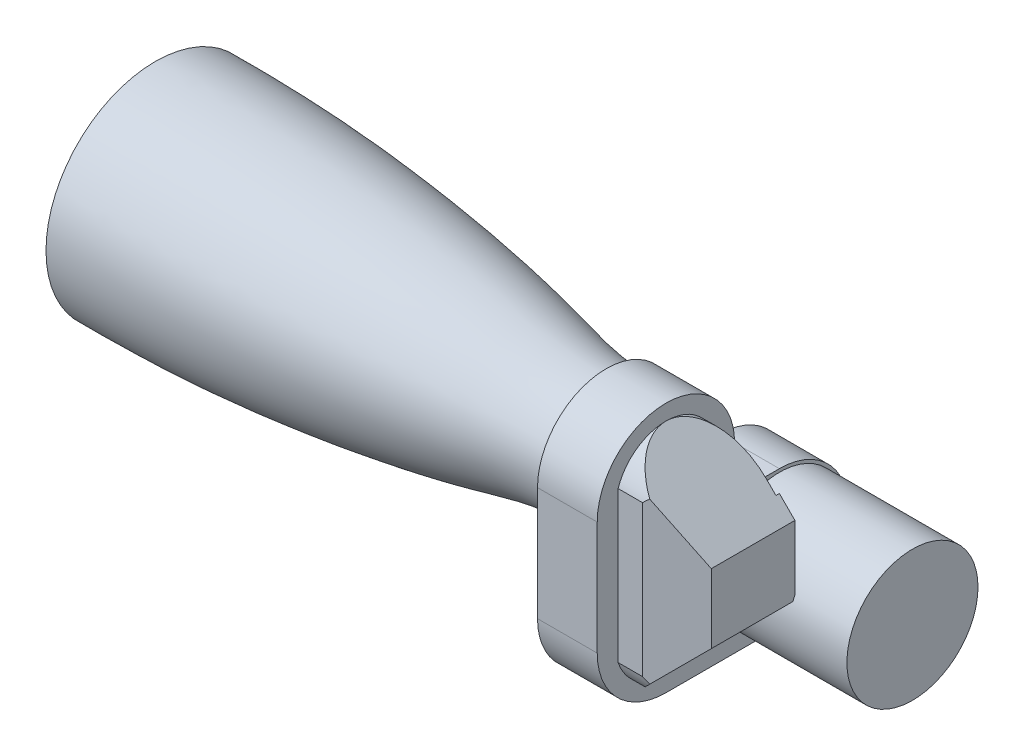
ISO-10303-21;
HEADER;
FILE_DESCRIPTION(('STEP AP214'),'2;1');
FILE_NAME('part.step','',(''),(''),'','','');
FILE_SCHEMA(('AUTOMOTIVE_DESIGN { 1 0 10303 214 1 1 1 1 }'));
ENDSEC;
DATA;
#1=APPLICATION_CONTEXT('core data for automotive mechanical design processes');
#2=APPLICATION_PROTOCOL_DEFINITION('international standard','automotive_design',2000,#1);
#3=PRODUCT_CONTEXT('',#1,'mechanical');
#4=PRODUCT('Part','Part','',(#3));
#5=PRODUCT_RELATED_PRODUCT_CATEGORY('part','',(#4));
#6=PRODUCT_DEFINITION_FORMATION('','',#4);
#7=PRODUCT_DEFINITION_CONTEXT('part definition',#1,'design');
#8=PRODUCT_DEFINITION('design','',#6,#7);
#9=PRODUCT_DEFINITION_SHAPE('','',#8);
#10=(LENGTH_UNIT() NAMED_UNIT(*) SI_UNIT(.MILLI.,.METRE.));
#11=(NAMED_UNIT(*) PLANE_ANGLE_UNIT() SI_UNIT($,.RADIAN.));
#12=(NAMED_UNIT(*) SI_UNIT($,.STERADIAN.) SOLID_ANGLE_UNIT());
#13=UNCERTAINTY_MEASURE_WITH_UNIT(LENGTH_MEASURE(1.E-05),#10,'distance_accuracy_value','');
#14=(GEOMETRIC_REPRESENTATION_CONTEXT(3) GLOBAL_UNCERTAINTY_ASSIGNED_CONTEXT((#13)) GLOBAL_UNIT_ASSIGNED_CONTEXT((#10,
#11,#12)) REPRESENTATION_CONTEXT('',''));
#15=CARTESIAN_POINT('',(0.,0.,0.));
#16=DIRECTION('',(0.,0.,1.));
#17=DIRECTION('',(1.,0.,0.));
#18=AXIS2_PLACEMENT_3D('',#15,#16,#17);
#19=CARTESIAN_POINT('',(0.,0.,-9.));
#20=DIRECTION('',(0.,0.,1.));
#21=DIRECTION('',(1.,0.,0.));
#22=AXIS2_PLACEMENT_3D('',#19,#20,#21);
#23=PLANE('',#22);
#24=DIRECTION('',(-1.,0.,0.));
#25=VECTOR('',#24,1.);
#26=CARTESIAN_POINT('',(107.78,-14.4777632746615,-9.));
#27=LINE('',#26,#25);
#28=CARTESIAN_POINT('',(95.5,-14.4777632746615,-9.));
#29=VERTEX_POINT('',#28);
#30=CARTESIAN_POINT('',(98.1,-14.4777632746615,-9.));
#31=VERTEX_POINT('',#30);
#32=EDGE_CURVE('E227',#29,#31,#27,.F.);
#33=ORIENTED_EDGE('',*,*,#32,.F.);
#34=DIRECTION('',(0.,1.,0.));
#35=VECTOR('',#34,1.);
#36=CARTESIAN_POINT('',(95.5,0.,-9.));
#37=LINE('',#36,#35);
#38=CARTESIAN_POINT('',(95.5,-1.10000000000001,-9.));
#39=VERTEX_POINT('',#38);
#40=EDGE_CURVE('E224',#29,#39,#37,.T.);
#41=ORIENTED_EDGE('',*,*,#40,.T.);
#42=DIRECTION('',(-0.707106781186548,0.707106781186547,0.));
#43=VECTOR('',#42,1.);
#44=CARTESIAN_POINT('',(98.1,-3.70000000000001,-9.));
#45=LINE('',#44,#43);
#46=CARTESIAN_POINT('',(98.1,-3.70000000000001,-9.));
#47=VERTEX_POINT('',#46);
#48=EDGE_CURVE('E287',#47,#39,#45,.T.);
#49=ORIENTED_EDGE('',*,*,#48,.F.);
#50=DIRECTION('',(0.,1.,0.));
#51=VECTOR('',#50,1.);
#52=CARTESIAN_POINT('',(98.1,-15.3,-9.));
#53=LINE('',#52,#51);
#54=EDGE_CURVE('E259',#31,#47,#53,.T.);
#55=ORIENTED_EDGE('',*,*,#54,.F.);
#56=EDGE_LOOP('',(#33,#41,#49,#55));
#57=FACE_BOUND('',#56,.T.);
#58=ADVANCED_FACE('F50',(#57),#23,.F.);
#59=CARTESIAN_POINT('',(95.5,-19.4764920865433,0.));
#60=DIRECTION('',(-1.,0.,0.));
#61=DIRECTION('',(0.,0.,1.));
#62=AXIS2_PLACEMENT_3D('',#59,#60,#61);
#63=CYLINDRICAL_SURFACE('',#62,8.4235079134567);
#64=DIRECTION('',(-1.,0.,0.));
#65=VECTOR('',#64,1.);
#66=CARTESIAN_POINT('',(96.64,-21.194043661412,-8.246544861682));
#67=LINE('',#66,#65);
#68=CARTESIAN_POINT('',(92.205956338588,-21.194043661412,-8.246544861682));
#69=VERTEX_POINT('',#68);
#70=CARTESIAN_POINT('',(85.5,-21.194043661412,-8.246544861682));
#71=VERTEX_POINT('',#70);
#72=EDGE_CURVE('E473',#69,#71,#67,.T.);
#73=ORIENTED_EDGE('',*,*,#72,.F.);
#74=CARTESIAN_POINT('',(93.9235079134567,-19.4764920865433,0.));
#75=DIRECTION('',(0.707106781186548,-0.707106781186547,0.));
#76=DIRECTION('',(-0.707106781186547,-0.707106781186548,0.));
#77=AXIS2_PLACEMENT_3D('',#74,#75,#76);
#78=ELLIPSE('',#77,11.9126391339675,8.4235079134567);
#79=CARTESIAN_POINT('',(85.5,-27.9,0.));
#80=VERTEX_POINT('',#79);
#81=EDGE_CURVE('E487',#69,#80,#78,.F.);
#82=ORIENTED_EDGE('',*,*,#81,.T.);
#83=CARTESIAN_POINT('',(85.5,-19.4764920865433,0.));
#84=DIRECTION('',(1.,0.,0.));
#85=DIRECTION('',(0.,0.,-1.));
#86=AXIS2_PLACEMENT_3D('',#83,#84,#85);
#87=CIRCLE('',#86,8.4235079134567);
#88=EDGE_CURVE('E479',#80,#71,#87,.T.);
#89=ORIENTED_EDGE('',*,*,#88,.T.);
#90=EDGE_LOOP('',(#73,#82,#89));
#91=FACE_BOUND('',#90,.T.);
#92=ADVANCED_FACE('F419',(#91),#63,.T.);
#93=CARTESIAN_POINT('',(95.5,0.476492086543301,-8.4235079134567));
#94=DIRECTION('',(0.,0.,1.));
#95=DIRECTION('',(0.,-1.,0.));
#96=AXIS2_PLACEMENT_3D('',#93,#94,#95);
#97=PLANE('',#96);
#98=DIRECTION('',(-1.,0.,0.));
#99=VECTOR('',#98,1.);
#100=CARTESIAN_POINT('',(107.78,-16.0693959422524,-8.4235079134567));
#101=LINE('',#100,#99);
#102=CARTESIAN_POINT('',(85.5,-16.0693959422524,-8.4235079134567));
#103=VERTEX_POINT('',#102);
#104=CARTESIAN_POINT('',(95.5,-16.0693959422524,-8.4235079134567));
#105=VERTEX_POINT('',#104);
#106=EDGE_CURVE('E209',#103,#105,#101,.F.);
#107=ORIENTED_EDGE('',*,*,#106,.F.);
#108=DIRECTION('',(0.,1.,0.));
#109=VECTOR('',#108,1.);
#110=CARTESIAN_POINT('',(85.5,0.476492086543301,-8.4235079134567));
#111=LINE('',#110,#109);
#112=CARTESIAN_POINT('',(85.5,0.476492086543301,-8.4235079134567));
#113=VERTEX_POINT('',#112);
#114=EDGE_CURVE('E218',#103,#113,#111,.T.);
#115=ORIENTED_EDGE('',*,*,#114,.T.);
#116=DIRECTION('',(-1.,0.,0.));
#117=VECTOR('',#116,1.);
#118=CARTESIAN_POINT('',(95.5,0.476492086543301,-8.4235079134567));
#119=LINE('',#118,#117);
#120=CARTESIAN_POINT('',(93.9235079134567,0.476492086543302,-8.4235079134567));
#121=VERTEX_POINT('',#120);
#122=EDGE_CURVE('E217',#121,#113,#119,.T.);
#123=ORIENTED_EDGE('',*,*,#122,.F.);
#124=DIRECTION('',(0.707106781186548,-0.707106781186547,0.));
#125=VECTOR('',#124,1.);
#126=CARTESIAN_POINT('',(98.1,-3.70000000000001,-8.4235079134567));
#127=LINE('',#126,#125);
#128=CARTESIAN_POINT('',(95.5,-1.10000000000001,-8.4235079134567));
#129=VERTEX_POINT('',#128);
#130=EDGE_CURVE('E213',#121,#129,#127,.T.);
#131=ORIENTED_EDGE('',*,*,#130,.T.);
#132=DIRECTION('',(0.,1.,0.));
#133=VECTOR('',#132,1.);
#134=CARTESIAN_POINT('',(95.5,0.476492086543301,-8.4235079134567));
#135=LINE('',#134,#133);
#136=EDGE_CURVE('E205',#105,#129,#135,.T.);
#137=ORIENTED_EDGE('',*,*,#136,.F.);
#138=EDGE_LOOP('',(#107,#115,#123,#131,#137));
#139=FACE_BOUND('',#138,.T.);
#140=ADVANCED_FACE('F207',(#139),#97,.F.);
#141=CARTESIAN_POINT('',(75.5,0.,-10.));
#142=CARTESIAN_POINT('',(69.7771319606139,0.,-10.));
#143=CARTESIAN_POINT('',(54.8823021301623,0.,-14.0807519619506));
#144=CARTESIAN_POINT('',(26.9900751891377,0.,-17.7428726670406));
#145=CARTESIAN_POINT('',(9.74070149054793,0.,-18.3));
#146=CARTESIAN_POINT('',(0.,0.,-18.3));
#147=B_SPLINE_CURVE_WITH_KNOTS('',3,(#141,#142,#143,#144,#145,#146),.UNSPECIFIED.,.F.,.F.,(4,1,
1,4),(0.,0.191187110643111,0.683672229909023,1.),.UNSPECIFIED.);
#148=CARTESIAN_POINT('',(0.,0.,0.));
#149=DIRECTION('',(-1.,0.,0.));
#150=AXIS1_PLACEMENT('',#148,#149);
#151=SURFACE_OF_REVOLUTION('',#147,#150);
#152=CARTESIAN_POINT('',(0.,0.,0.));
#153=DIRECTION('',(-1.,0.,0.));
#154=DIRECTION('',(0.,0.,1.));
#155=AXIS2_PLACEMENT_3D('',#152,#153,#154);
#156=CIRCLE('',#155,18.3);
#157=CARTESIAN_POINT('',(0.,0.,18.3));
#158=VERTEX_POINT('',#157);
#159=EDGE_CURVE('E298',#158,#158,#156,.T.);
#160=ORIENTED_EDGE('',*,*,#159,.F.);
#161=EDGE_LOOP('',(#160));
#162=FACE_BOUND('',#161,.T.);
#163=CARTESIAN_POINT('',(75.5,0.,0.));
#164=DIRECTION('',(-1.,0.,0.));
#165=DIRECTION('',(0.,0.,1.));
#166=AXIS2_PLACEMENT_3D('',#163,#164,#165);
#167=CIRCLE('',#166,10.);
#168=CARTESIAN_POINT('',(75.5,0.,10.));
#169=VERTEX_POINT('',#168);
#170=EDGE_CURVE('E355',#169,#169,#167,.T.);
#171=ORIENTED_EDGE('',*,*,#170,.T.);
#172=EDGE_LOOP('',(#171));
#173=FACE_BOUND('',#172,.T.);
#174=ADVANCED_FACE('F363',(#162,#173),#151,.T.);
#175=CARTESIAN_POINT('',(0.,0.,0.));
#176=DIRECTION('',(1.,0.,0.));
#177=DIRECTION('',(0.,0.,-1.));
#178=AXIS2_PLACEMENT_3D('',#175,#176,#177);
#179=PLANE('',#178);
#180=ORIENTED_EDGE('',*,*,#159,.T.);
#181=EDGE_LOOP('',(#180));
#182=FACE_BOUND('',#181,.T.);
#183=ADVANCED_FACE('F366',(#182),#179,.F.);
#184=CARTESIAN_POINT('',(85.5,0.,11.5));
#185=DIRECTION('',(0.,0.,-1.));
#186=DIRECTION('',(0.,1.,0.));
#187=AXIS2_PLACEMENT_3D('',#184,#185,#186);
#188=PLANE('',#187);
#189=DIRECTION('',(0.,-1.,0.));
#190=VECTOR('',#189,1.);
#191=CARTESIAN_POINT('',(75.5,0.,11.5));
#192=LINE('',#191,#190);
#193=CARTESIAN_POINT('',(75.5,0.,11.5));
#194=VERTEX_POINT('',#193);
#195=CARTESIAN_POINT('',(75.5,-19.,11.5));
#196=VERTEX_POINT('',#195);
#197=EDGE_CURVE('E260',#194,#196,#192,.T.);
#198=ORIENTED_EDGE('',*,*,#197,.T.);
#199=DIRECTION('',(-1.,0.,0.));
#200=VECTOR('',#199,1.);
#201=CARTESIAN_POINT('',(85.5,-19.,11.5));
#202=LINE('',#201,#200);
#203=CARTESIAN_POINT('',(85.5,-19.,11.5));
#204=VERTEX_POINT('',#203);
#205=EDGE_CURVE('E352',#204,#196,#202,.T.);
#206=ORIENTED_EDGE('',*,*,#205,.F.);
#207=DIRECTION('',(0.,-1.,0.));
#208=VECTOR('',#207,1.);
#209=CARTESIAN_POINT('',(85.5,0.,11.5));
#210=LINE('',#209,#208);
#211=CARTESIAN_POINT('',(85.5,0.,11.5));
#212=VERTEX_POINT('',#211);
#213=EDGE_CURVE('E300',#212,#204,#210,.T.);
#214=ORIENTED_EDGE('',*,*,#213,.F.);
#215=DIRECTION('',(-1.,0.,0.));
#216=VECTOR('',#215,1.);
#217=CARTESIAN_POINT('',(85.5,0.,11.5));
#218=LINE('',#217,#216);
#219=EDGE_CURVE('E318',#212,#194,#218,.T.);
#220=ORIENTED_EDGE('',*,*,#219,.T.);
#221=EDGE_LOOP('',(#198,#206,#214,#220));
#222=FACE_BOUND('',#221,.T.);
#223=ADVANCED_FACE('F370',(#222),#188,.F.);
#224=CARTESIAN_POINT('',(85.5,-19.,0.));
#225=DIRECTION('',(-1.,0.,0.));
#226=DIRECTION('',(0.,0.,1.));
#227=AXIS2_PLACEMENT_3D('',#224,#225,#226);
#228=CYLINDRICAL_SURFACE('',#227,11.5);
#229=CARTESIAN_POINT('',(75.5,-19.,0.));
#230=DIRECTION('',(1.,0.,0.));
#231=DIRECTION('',(0.,0.,-1.));
#232=AXIS2_PLACEMENT_3D('',#229,#230,#231);
#233=CIRCLE('',#232,11.5);
#234=CARTESIAN_POINT('',(75.5,-30.5,0.));
#235=VERTEX_POINT('',#234);
#236=EDGE_CURVE('E321',#196,#235,#233,.T.);
#237=ORIENTED_EDGE('',*,*,#236,.T.);
#238=DIRECTION('',(-1.,0.,0.));
#239=VECTOR('',#238,1.);
#240=CARTESIAN_POINT('',(85.5,-30.5,0.));
#241=LINE('',#240,#239);
#242=CARTESIAN_POINT('',(85.5,-30.5,0.));
#243=VERTEX_POINT('',#242);
#244=EDGE_CURVE('E350',#243,#235,#241,.T.);
#245=ORIENTED_EDGE('',*,*,#244,.F.);
#246=CARTESIAN_POINT('',(85.5,-19.,0.));
#247=DIRECTION('',(1.,0.,0.));
#248=DIRECTION('',(0.,0.,-1.));
#249=AXIS2_PLACEMENT_3D('',#246,#247,#248);
#250=CIRCLE('',#249,11.5);
#251=EDGE_CURVE('E303',#204,#243,#250,.T.);
#252=ORIENTED_EDGE('',*,*,#251,.F.);
#253=ORIENTED_EDGE('',*,*,#205,.T.);
#254=EDGE_LOOP('',(#237,#245,#252,#253));
#255=FACE_BOUND('',#254,.T.);
#256=ADVANCED_FACE('F374',(#255),#228,.T.);
#257=CARTESIAN_POINT('',(85.5,-30.5,-19.));
#258=DIRECTION('',(0.,-1.,0.));
#259=DIRECTION('',(0.,0.,-1.));
#260=AXIS2_PLACEMENT_3D('',#257,#258,#259);
#261=PLANE('',#260);
#262=DIRECTION('',(0.,0.,1.));
#263=VECTOR('',#262,1.);
#264=CARTESIAN_POINT('',(75.5,-30.5,-19.));
#265=LINE('',#264,#263);
#266=CARTESIAN_POINT('',(75.5,-30.5,-19.));
#267=VERTEX_POINT('',#266);
#268=EDGE_CURVE('E324',#267,#235,#265,.T.);
#269=ORIENTED_EDGE('',*,*,#268,.F.);
#270=DIRECTION('',(-1.,0.,0.));
#271=VECTOR('',#270,1.);
#272=CARTESIAN_POINT('',(85.5,-30.5,-19.));
#273=LINE('',#272,#271);
#274=CARTESIAN_POINT('',(85.5,-30.5,-19.));
#275=VERTEX_POINT('',#274);
#276=EDGE_CURVE('E348',#275,#267,#273,.T.);
#277=ORIENTED_EDGE('',*,*,#276,.F.);
#278=DIRECTION('',(0.,0.,1.));
#279=VECTOR('',#278,1.);
#280=CARTESIAN_POINT('',(85.5,-30.5,-19.));
#281=LINE('',#280,#279);
#282=EDGE_CURVE('E306',#275,#243,#281,.T.);
#283=ORIENTED_EDGE('',*,*,#282,.T.);
#284=ORIENTED_EDGE('',*,*,#244,.T.);
#285=EDGE_LOOP('',(#269,#277,#283,#284));
#286=FACE_BOUND('',#285,.T.);
#287=ADVANCED_FACE('F378',(#286),#261,.T.);
#288=CARTESIAN_POINT('',(85.5,-19.,-19.));
#289=DIRECTION('',(-1.,0.,0.));
#290=DIRECTION('',(0.,0.,1.));
#291=AXIS2_PLACEMENT_3D('',#288,#289,#290);
#292=CYLINDRICAL_SURFACE('',#291,11.5);
#293=CARTESIAN_POINT('',(75.5,-19.,-19.));
#294=DIRECTION('',(1.,0.,0.));
#295=DIRECTION('',(0.,0.,-1.));
#296=AXIS2_PLACEMENT_3D('',#293,#294,#295);
#297=CIRCLE('',#296,11.5);
#298=CARTESIAN_POINT('',(75.5,-25.5,-28.4868329805052));
#299=VERTEX_POINT('',#298);
#300=EDGE_CURVE('E328',#267,#299,#297,.T.);
#301=ORIENTED_EDGE('',*,*,#300,.T.);
#302=CARTESIAN_POINT('',(75.5,-23.686346742063,-29.5018167101295));
#303=VERTEX_POINT('',#302);
#304=EDGE_CURVE('E332',#299,#303,#297,.T.);
#305=ORIENTED_EDGE('',*,*,#304,.T.);
#306=CARTESIAN_POINT('',(75.5,-7.5,-19.));
#307=VERTEX_POINT('',#306);
#308=EDGE_CURVE('E327',#303,#307,#297,.T.);
#309=ORIENTED_EDGE('',*,*,#308,.T.);
#310=DIRECTION('',(-1.,0.,0.));
#311=VECTOR('',#310,1.);
#312=CARTESIAN_POINT('',(85.5,-7.5,-19.));
#313=LINE('',#312,#311);
#314=CARTESIAN_POINT('',(85.5,-7.5,-19.));
#315=VERTEX_POINT('',#314);
#316=EDGE_CURVE('E345',#315,#307,#313,.T.);
#317=ORIENTED_EDGE('',*,*,#316,.F.);
#318=CARTESIAN_POINT('',(85.5,-19.,-19.));
#319=DIRECTION('',(1.,0.,0.));
#320=DIRECTION('',(0.,0.,-1.));
#321=AXIS2_PLACEMENT_3D('',#318,#319,#320);
#322=CIRCLE('',#321,11.5);
#323=EDGE_CURVE('E309',#275,#315,#322,.T.);
#324=ORIENTED_EDGE('',*,*,#323,.F.);
#325=ORIENTED_EDGE('',*,*,#276,.T.);
#326=EDGE_LOOP('',(#301,#305,#309,#317,#324,#325));
#327=FACE_BOUND('',#326,.T.);
#328=ADVANCED_FACE('F382',(#327),#292,.T.);
#329=CARTESIAN_POINT('',(85.5,-7.5,-19.));
#330=DIRECTION('',(0.,-1.,0.));
#331=DIRECTION('',(0.,0.,-1.));
#332=AXIS2_PLACEMENT_3D('',#329,#330,#331);
#333=PLANE('',#332);
#334=DIRECTION('',(0.,0.,1.));
#335=VECTOR('',#334,1.);
#336=CARTESIAN_POINT('',(75.5,-7.5,-19.));
#337=LINE('',#336,#335);
#338=CARTESIAN_POINT('',(75.5,-7.5,-11.5));
#339=VERTEX_POINT('',#338);
#340=EDGE_CURVE('E331',#307,#339,#337,.T.);
#341=ORIENTED_EDGE('',*,*,#340,.T.);
#342=DIRECTION('',(-1.,0.,0.));
#343=VECTOR('',#342,1.);
#344=CARTESIAN_POINT('',(85.5,-7.5,-11.5));
#345=LINE('',#344,#343);
#346=CARTESIAN_POINT('',(85.5,-7.5,-11.5));
#347=VERTEX_POINT('',#346);
#348=EDGE_CURVE('E343',#347,#339,#345,.T.);
#349=ORIENTED_EDGE('',*,*,#348,.F.);
#350=DIRECTION('',(0.,0.,1.));
#351=VECTOR('',#350,1.);
#352=CARTESIAN_POINT('',(85.5,-7.5,-19.));
#353=LINE('',#352,#351);
#354=EDGE_CURVE('E311',#315,#347,#353,.T.);
#355=ORIENTED_EDGE('',*,*,#354,.F.);
#356=ORIENTED_EDGE('',*,*,#316,.T.);
#357=EDGE_LOOP('',(#341,#349,#355,#356));
#358=FACE_BOUND('',#357,.T.);
#359=ADVANCED_FACE('F386',(#358),#333,.F.);
#360=CARTESIAN_POINT('',(85.5,0.,-11.5));
#361=DIRECTION('',(0.,0.,-1.));
#362=DIRECTION('',(0.,1.,0.));
#363=AXIS2_PLACEMENT_3D('',#360,#361,#362);
#364=PLANE('',#363);
#365=DIRECTION('',(0.,-1.,0.));
#366=VECTOR('',#365,1.);
#367=CARTESIAN_POINT('',(75.5,0.,-11.5));
#368=LINE('',#367,#366);
#369=CARTESIAN_POINT('',(75.5,0.,-11.5));
#370=VERTEX_POINT('',#369);
#371=EDGE_CURVE('E335',#370,#339,#368,.T.);
#372=ORIENTED_EDGE('',*,*,#371,.F.);
#373=DIRECTION('',(-1.,0.,0.));
#374=VECTOR('',#373,1.);
#375=CARTESIAN_POINT('',(85.5,0.,-11.5));
#376=LINE('',#375,#374);
#377=CARTESIAN_POINT('',(85.5,0.,-11.5));
#378=VERTEX_POINT('',#377);
#379=EDGE_CURVE('E341',#378,#370,#376,.T.);
#380=ORIENTED_EDGE('',*,*,#379,.F.);
#381=DIRECTION('',(0.,-1.,0.));
#382=VECTOR('',#381,1.);
#383=CARTESIAN_POINT('',(85.5,0.,-11.5));
#384=LINE('',#383,#382);
#385=EDGE_CURVE('E313',#378,#347,#384,.T.);
#386=ORIENTED_EDGE('',*,*,#385,.T.);
#387=ORIENTED_EDGE('',*,*,#348,.T.);
#388=EDGE_LOOP('',(#372,#380,#386,#387));
#389=FACE_BOUND('',#388,.T.);
#390=ADVANCED_FACE('F390',(#389),#364,.T.);
#391=CARTESIAN_POINT('',(85.5,0.,0.));
#392=DIRECTION('',(-1.,0.,0.));
#393=DIRECTION('',(0.,0.,1.));
#394=AXIS2_PLACEMENT_3D('',#391,#392,#393);
#395=CYLINDRICAL_SURFACE('',#394,11.5);
#396=CARTESIAN_POINT('',(75.5,0.,0.));
#397=DIRECTION('',(1.,0.,0.));
#398=DIRECTION('',(0.,0.,-1.));
#399=AXIS2_PLACEMENT_3D('',#396,#397,#398);
#400=CIRCLE('',#399,11.5);
#401=EDGE_CURVE('E304',#370,#194,#400,.T.);
#402=ORIENTED_EDGE('',*,*,#401,.T.);
#403=ORIENTED_EDGE('',*,*,#219,.F.);
#404=CARTESIAN_POINT('',(85.5,0.,0.));
#405=DIRECTION('',(1.,0.,0.));
#406=DIRECTION('',(0.,0.,-1.));
#407=AXIS2_PLACEMENT_3D('',#404,#405,#406);
#408=CIRCLE('',#407,11.5);
#409=EDGE_CURVE('E316',#378,#212,#408,.T.);
#410=ORIENTED_EDGE('',*,*,#409,.F.);
#411=ORIENTED_EDGE('',*,*,#379,.T.);
#412=EDGE_LOOP('',(#402,#403,#410,#411));
#413=FACE_BOUND('',#412,.T.);
#414=ADVANCED_FACE('F394',(#413),#395,.T.);
#415=CARTESIAN_POINT('',(85.5,-19.,0.));
#416=DIRECTION('',(1.,0.,0.));
#417=DIRECTION('',(0.,0.,-1.));
#418=AXIS2_PLACEMENT_3D('',#415,#416,#417);
#419=PLANE('',#418);
#420=ORIENTED_EDGE('',*,*,#114,.F.);
#421=CARTESIAN_POINT('',(85.5,-19.,-19.));
#422=DIRECTION('',(1.,0.,0.));
#423=DIRECTION('',(0.,0.,-1.));
#424=AXIS2_PLACEMENT_3D('',#421,#422,#423);
#425=CIRCLE('',#424,10.975);
#426=EDGE_CURVE('E234',#71,#103,#425,.T.);
#427=ORIENTED_EDGE('',*,*,#426,.F.);
#428=ORIENTED_EDGE('',*,*,#88,.F.);
#429=CARTESIAN_POINT('',(85.5,-22.1138175439087,8.));
#430=VERTEX_POINT('',#429);
#431=EDGE_CURVE('E482',#430,#80,#87,.T.);
#432=ORIENTED_EDGE('',*,*,#431,.F.);
#433=DIRECTION('',(0.,-1.,0.));
#434=VECTOR('',#433,1.);
#435=CARTESIAN_POINT('',(85.5,8.9,8.));
#436=LINE('',#435,#434);
#437=CARTESIAN_POINT('',(85.5,3.11381754390869,8.));
#438=VERTEX_POINT('',#437);
#439=EDGE_CURVE('E278',#438,#430,#436,.T.);
#440=ORIENTED_EDGE('',*,*,#439,.F.);
#441=CARTESIAN_POINT('',(85.5,0.476492086543301,0.));
#442=DIRECTION('',(1.,0.,0.));
#443=DIRECTION('',(0.,0.,-1.));
#444=AXIS2_PLACEMENT_3D('',#441,#442,#443);
#445=CIRCLE('',#444,8.42350791345669);
#446=CARTESIAN_POINT('',(85.5,8.9,0.));
#447=VERTEX_POINT('',#446);
#448=EDGE_CURVE('E474',#447,#438,#445,.T.);
#449=ORIENTED_EDGE('',*,*,#448,.F.);
#450=EDGE_CURVE('E476',#113,#447,#445,.T.);
#451=ORIENTED_EDGE('',*,*,#450,.F.);
#452=EDGE_LOOP('',(#420,#427,#428,#432,#440,#449,#451));
#453=FACE_BOUND('',#452,.T.);
#454=ORIENTED_EDGE('',*,*,#251,.T.);
#455=ORIENTED_EDGE('',*,*,#282,.F.);
#456=ORIENTED_EDGE('',*,*,#323,.T.);
#457=ORIENTED_EDGE('',*,*,#354,.T.);
#458=ORIENTED_EDGE('',*,*,#385,.F.);
#459=ORIENTED_EDGE('',*,*,#409,.T.);
#460=ORIENTED_EDGE('',*,*,#213,.T.);
#461=EDGE_LOOP('',(#454,#455,#456,#457,#458,#459,#460));
#462=FACE_BOUND('',#461,.T.);
#463=ADVANCED_FACE('F398',(#453,#462),#419,.T.);
#464=CARTESIAN_POINT('',(75.5,-19.,0.));
#465=DIRECTION('',(1.,0.,0.));
#466=DIRECTION('',(0.,0.,-1.));
#467=AXIS2_PLACEMENT_3D('',#464,#465,#466);
#468=PLANE('',#467);
#469=ORIENTED_EDGE('',*,*,#170,.F.);
#470=EDGE_LOOP('',(#469));
#471=FACE_BOUND('',#470,.T.);
#472=ORIENTED_EDGE('',*,*,#308,.F.);
#473=DIRECTION('',(0.,-1.,0.));
#474=VECTOR('',#473,1.);
#475=CARTESIAN_POINT('',(75.5,-15.5,-29.5018167101295));
#476=LINE('',#475,#474);
#477=CARTESIAN_POINT('',(75.5,-15.5,-29.5018167101295));
#478=VERTEX_POINT('',#477);
#479=EDGE_CURVE('E294',#478,#303,#476,.T.);
#480=ORIENTED_EDGE('',*,*,#479,.F.);
#481=DIRECTION('',(0.,0.,1.));
#482=VECTOR('',#481,1.);
#483=CARTESIAN_POINT('',(75.5,-15.5,-29.5018167101295));
#484=LINE('',#483,#482);
#485=CARTESIAN_POINT('',(75.5,-15.5,6.49101913981334));
#486=VERTEX_POINT('',#485);
#487=EDGE_CURVE('E489',#478,#486,#484,.T.);
#488=ORIENTED_EDGE('',*,*,#487,.T.);
#489=DIRECTION('',(0.,-1.,0.));
#490=VECTOR('',#489,1.);
#491=CARTESIAN_POINT('',(75.5,-15.5,6.49101913981334));
#492=LINE('',#491,#490);
#493=CARTESIAN_POINT('',(75.5,-25.5,6.49101913981334));
#494=VERTEX_POINT('',#493);
#495=EDGE_CURVE('E502',#486,#494,#492,.T.);
#496=ORIENTED_EDGE('',*,*,#495,.T.);
#497=DIRECTION('',(0.,0.,-1.));
#498=VECTOR('',#497,1.);
#499=CARTESIAN_POINT('',(75.5,-25.5,0.));
#500=LINE('',#499,#498);
#501=EDGE_CURVE('E280',#494,#299,#500,.T.);
#502=ORIENTED_EDGE('',*,*,#501,.T.);
#503=ORIENTED_EDGE('',*,*,#300,.F.);
#504=ORIENTED_EDGE('',*,*,#268,.T.);
#505=ORIENTED_EDGE('',*,*,#236,.F.);
#506=ORIENTED_EDGE('',*,*,#197,.F.);
#507=ORIENTED_EDGE('',*,*,#401,.F.);
#508=ORIENTED_EDGE('',*,*,#371,.T.);
#509=ORIENTED_EDGE('',*,*,#340,.F.);
#510=EDGE_LOOP('',(#472,#480,#488,#496,#502,#503,#504,#505,#506,#507,#508,#509));
#511=FACE_BOUND('',#510,.T.);
#512=ADVANCED_FACE('F400',(#471,#511),#468,.F.);
#513=CARTESIAN_POINT('',(85.5,-27.9,-9.));
#514=DIRECTION('',(0.707106781186548,-0.707106781186547,0.));
#515=DIRECTION('',(0.707106781186547,0.707106781186548,0.));
#516=AXIS2_PLACEMENT_3D('',#513,#514,#515);
#517=PLANE('',#516);
#518=DIRECTION('',(0.,0.,1.));
#519=VECTOR('',#518,1.);
#520=CARTESIAN_POINT('',(98.1,-15.3,-9.));
#521=LINE('',#520,#519);
#522=CARTESIAN_POINT('',(98.1,-15.3,-8.66749667311934));
#523=VERTEX_POINT('',#522);
#524=CARTESIAN_POINT('',(98.1,-15.3,5.));
#525=VERTEX_POINT('',#524);
#526=EDGE_CURVE('E261',#523,#525,#521,.T.);
#527=ORIENTED_EDGE('',*,*,#526,.T.);
#528=DIRECTION('',(0.686064165430572,0.686064165430573,-0.242140293681376));
#529=VECTOR('',#528,1.);
#530=CARTESIAN_POINT('',(88.5644951140065,-24.8355048859935,8.36547231270356));
#531=LINE('',#530,#529);
#532=CARTESIAN_POINT('',(90.4823809366548,-22.9176190633452,7.68857143412181));
#533=VERTEX_POINT('',#532);
#534=EDGE_CURVE('E58',#525,#533,#531,.F.);
#535=ORIENTED_EDGE('',*,*,#534,.T.);
#536=EDGE_CURVE('E271',#80,#533,#78,.F.);
#537=ORIENTED_EDGE('',*,*,#536,.F.);
#538=ORIENTED_EDGE('',*,*,#81,.F.);
#539=CARTESIAN_POINT('',(94.4,-19.,-19.));
#540=DIRECTION('',(0.707106781186548,-0.707106781186547,0.));
#541=DIRECTION('',(-0.707106781186547,-0.707106781186548,0.));
#542=AXIS2_PLACEMENT_3D('',#539,#540,#541);
#543=ELLIPSE('',#542,15.5209938470447,10.975);
#544=EDGE_CURVE('E471',#69,#523,#543,.F.);
#545=ORIENTED_EDGE('',*,*,#544,.T.);
#546=EDGE_LOOP('',(#527,#535,#537,#538,#545));
#547=FACE_BOUND('',#546,.T.);
#548=ADVANCED_FACE('F403',(#547),#517,.T.);
#549=CARTESIAN_POINT('',(98.1,-3.70000000000001,-9.));
#550=DIRECTION('',(0.707106781186547,0.707106781186548,0.));
#551=DIRECTION('',(-0.707106781186548,0.707106781186547,0.));
#552=AXIS2_PLACEMENT_3D('',#549,#550,#551);
#553=PLANE('',#552);
#554=CARTESIAN_POINT('',(93.9235079134567,0.476492086543301,0.));
#555=DIRECTION('',(0.707106781186547,0.707106781186548,0.));
#556=DIRECTION('',(-0.707106781186548,0.707106781186547,0.));
#557=AXIS2_PLACEMENT_3D('',#554,#555,#556);
#558=ELLIPSE('',#557,11.9126391339676,8.42350791345669);
#559=CARTESIAN_POINT('',(90.4823809366548,3.91761906334519,7.6885714341218));
#560=VERTEX_POINT('',#559);
#561=EDGE_CURVE('E255',#560,#447,#558,.F.);
#562=ORIENTED_EDGE('',*,*,#561,.F.);
#563=DIRECTION('',(-0.686064165430573,0.686064165430573,0.242140293681376));
#564=VECTOR('',#563,1.);
#565=CARTESIAN_POINT('',(100.425732899023,-6.02573289902279,4.17915309446255));
#566=LINE('',#565,#564);
#567=CARTESIAN_POINT('',(98.1,-3.70000000000001,5.));
#568=VERTEX_POINT('',#567);
#569=EDGE_CURVE('E244',#560,#568,#566,.F.);
#570=ORIENTED_EDGE('',*,*,#569,.T.);
#571=DIRECTION('',(0.,0.,1.));
#572=VECTOR('',#571,1.);
#573=CARTESIAN_POINT('',(98.1,-3.70000000000001,-9.));
#574=LINE('',#573,#572);
#575=EDGE_CURVE('E252',#47,#568,#574,.T.);
#576=ORIENTED_EDGE('',*,*,#575,.F.);
#577=ORIENTED_EDGE('',*,*,#48,.T.);
#578=DIRECTION('',(0.,0.,-1.));
#579=VECTOR('',#578,1.);
#580=CARTESIAN_POINT('',(95.5,-1.10000000000001,-9.));
#581=LINE('',#580,#579);
#582=EDGE_CURVE('E288',#129,#39,#581,.T.);
#583=ORIENTED_EDGE('',*,*,#582,.F.);
#584=ORIENTED_EDGE('',*,*,#130,.F.);
#585=EDGE_CURVE('E290',#447,#121,#558,.F.);
#586=ORIENTED_EDGE('',*,*,#585,.F.);
#587=EDGE_LOOP('',(#562,#570,#576,#577,#583,#584,#586));
#588=FACE_BOUND('',#587,.T.);
#589=ADVANCED_FACE('F250',(#588),#553,.T.);
#590=CARTESIAN_POINT('',(98.1,-15.3,-9.));
#591=DIRECTION('',(1.,0.,0.));
#592=DIRECTION('',(0.,0.,-1.));
#593=AXIS2_PLACEMENT_3D('',#590,#591,#592);
#594=PLANE('',#593);
#595=ORIENTED_EDGE('',*,*,#575,.T.);
#596=DIRECTION('',(0.,-1.,0.));
#597=VECTOR('',#596,1.);
#598=CARTESIAN_POINT('',(98.1,-15.3,5.));
#599=LINE('',#598,#597);
#600=EDGE_CURVE('E72',#568,#525,#599,.T.);
#601=ORIENTED_EDGE('',*,*,#600,.T.);
#602=ORIENTED_EDGE('',*,*,#526,.F.);
#603=CARTESIAN_POINT('',(98.1,-19.,-19.));
#604=DIRECTION('',(1.,0.,0.));
#605=DIRECTION('',(0.,0.,-1.));
#606=AXIS2_PLACEMENT_3D('',#603,#604,#605);
#607=CIRCLE('',#606,10.975);
#608=EDGE_CURVE('E469',#523,#31,#607,.F.);
#609=ORIENTED_EDGE('',*,*,#608,.T.);
#610=ORIENTED_EDGE('',*,*,#54,.T.);
#611=EDGE_LOOP('',(#595,#601,#602,#609,#610));
#612=FACE_BOUND('',#611,.T.);
#613=ADVANCED_FACE('F257',(#612),#594,.T.);
#614=CARTESIAN_POINT('',(0.,0.,8.));
#615=DIRECTION('',(0.,0.,1.));
#616=DIRECTION('',(1.,0.,0.));
#617=AXIS2_PLACEMENT_3D('',#614,#615,#616);
#618=PLANE('',#617);
#619=DIRECTION('',(-1.,0.,0.));
#620=VECTOR('',#619,1.);
#621=CARTESIAN_POINT('',(95.5,-22.1138175439087,8.));
#622=LINE('',#621,#620);
#623=CARTESIAN_POINT('',(89.5999999999999,-22.1138175439087,8.));
#624=VERTEX_POINT('',#623);
#625=EDGE_CURVE('E269',#624,#430,#622,.T.);
#626=ORIENTED_EDGE('',*,*,#625,.F.);
#627=DIRECTION('',(0.,1.,0.));
#628=VECTOR('',#627,1.);
#629=CARTESIAN_POINT('',(89.5999999999999,0.,8.));
#630=LINE('',#629,#628);
#631=CARTESIAN_POINT('',(89.5999999999999,3.11381754390869,8.));
#632=VERTEX_POINT('',#631);
#633=EDGE_CURVE('E235',#624,#632,#630,.T.);
#634=ORIENTED_EDGE('',*,*,#633,.T.);
#635=DIRECTION('',(-1.,0.,0.));
#636=VECTOR('',#635,1.);
#637=CARTESIAN_POINT('',(95.5,3.11381754390869,8.));
#638=LINE('',#637,#636);
#639=EDGE_CURVE('E279',#438,#632,#638,.F.);
#640=ORIENTED_EDGE('',*,*,#639,.F.);
#641=ORIENTED_EDGE('',*,*,#439,.T.);
#642=EDGE_LOOP('',(#626,#634,#640,#641));
#643=FACE_BOUND('',#642,.T.);
#644=ADVANCED_FACE('F274',(#643),#618,.T.);
#645=CARTESIAN_POINT('',(75.5,-15.5,-29.5018167101295));
#646=DIRECTION('',(1.,0.,0.));
#647=DIRECTION('',(0.,0.,-1.));
#648=AXIS2_PLACEMENT_3D('',#645,#646,#647);
#649=PLANE('',#648);
#650=ORIENTED_EDGE('',*,*,#304,.F.);
#651=DIRECTION('',(0.,0.,1.));
#652=VECTOR('',#651,1.);
#653=CARTESIAN_POINT('',(75.5,-25.5,-29.5018167101295));
#654=LINE('',#653,#652);
#655=CARTESIAN_POINT('',(75.5,-25.5,-29.5018167101295));
#656=VERTEX_POINT('',#655);
#657=EDGE_CURVE('E289',#656,#299,#654,.T.);
#658=ORIENTED_EDGE('',*,*,#657,.F.);
#659=EDGE_CURVE('E514',#303,#656,#476,.T.);
#660=ORIENTED_EDGE('',*,*,#659,.F.);
#661=EDGE_LOOP('',(#650,#658,#660));
#662=FACE_BOUND('',#661,.T.);
#663=ADVANCED_FACE('F416',(#662),#649,.T.);
#664=CARTESIAN_POINT('',(61.8542631074293,-15.5,-15.8560798175588));
#665=DIRECTION('',(-0.707106781186547,0.,-0.707106781186548));
#666=DIRECTION('',(-0.707106781186548,0.,0.707106781186547));
#667=AXIS2_PLACEMENT_3D('',#664,#665,#666);
#668=PLANE('',#667);
#669=DIRECTION('',(0.707106781186548,0.,-0.707106781186547));
#670=VECTOR('',#669,1.);
#671=CARTESIAN_POINT('',(61.8542631074293,-25.5,-15.8560798175588));
#672=LINE('',#671,#670);
#673=CARTESIAN_POINT('',(61.8542631074293,-25.5,-15.8560798175588));
#674=VERTEX_POINT('',#673);
#675=EDGE_CURVE('E493',#674,#656,#672,.T.);
#676=ORIENTED_EDGE('',*,*,#675,.F.);
#677=DIRECTION('',(0.,-1.,0.));
#678=VECTOR('',#677,1.);
#679=CARTESIAN_POINT('',(61.8542631074293,-15.5,-15.8560798175588));
#680=LINE('',#679,#678);
#681=CARTESIAN_POINT('',(61.8542631074293,-15.5,-15.8560798175588));
#682=VERTEX_POINT('',#681);
#683=EDGE_CURVE('E515',#682,#674,#680,.T.);
#684=ORIENTED_EDGE('',*,*,#683,.F.);
#685=DIRECTION('',(0.707106781186548,0.,-0.707106781186547));
#686=VECTOR('',#685,1.);
#687=CARTESIAN_POINT('',(61.8542631074293,-15.5,-15.8560798175588));
#688=LINE('',#687,#686);
#689=EDGE_CURVE('E499',#682,#478,#688,.T.);
#690=ORIENTED_EDGE('',*,*,#689,.T.);
#691=ORIENTED_EDGE('',*,*,#479,.T.);
#692=ORIENTED_EDGE('',*,*,#659,.T.);
#693=EDGE_LOOP('',(#676,#684,#690,#691,#692));
#694=FACE_BOUND('',#693,.T.);
#695=ADVANCED_FACE('F422',(#694),#668,.T.);
#696=CARTESIAN_POINT('',(61.8542631074293,-15.5,-7.15471775275735));
#697=DIRECTION('',(-1.,0.,0.));
#698=DIRECTION('',(0.,0.,1.));
#699=AXIS2_PLACEMENT_3D('',#696,#697,#698);
#700=PLANE('',#699);
#701=DIRECTION('',(0.,0.,-1.));
#702=VECTOR('',#701,1.);
#703=CARTESIAN_POINT('',(61.8542631074293,-25.5,-7.15471775275735));
#704=LINE('',#703,#702);
#705=CARTESIAN_POINT('',(61.8542631074293,-25.5,-7.15471775275735));
#706=VERTEX_POINT('',#705);
#707=EDGE_CURVE('E507',#706,#674,#704,.T.);
#708=ORIENTED_EDGE('',*,*,#707,.F.);
#709=DIRECTION('',(0.,-1.,0.));
#710=VECTOR('',#709,1.);
#711=CARTESIAN_POINT('',(61.8542631074293,-15.5,-7.15471775275735));
#712=LINE('',#711,#710);
#713=CARTESIAN_POINT('',(61.8542631074293,-15.5,-7.15471775275735));
#714=VERTEX_POINT('',#713);
#715=EDGE_CURVE('E517',#714,#706,#712,.T.);
#716=ORIENTED_EDGE('',*,*,#715,.F.);
#717=DIRECTION('',(0.,0.,-1.));
#718=VECTOR('',#717,1.);
#719=CARTESIAN_POINT('',(61.8542631074293,-15.5,-7.15471775275735));
#720=LINE('',#719,#718);
#721=EDGE_CURVE('E496',#714,#682,#720,.T.);
#722=ORIENTED_EDGE('',*,*,#721,.T.);
#723=ORIENTED_EDGE('',*,*,#683,.T.);
#724=EDGE_LOOP('',(#708,#716,#722,#723));
#725=FACE_BOUND('',#724,.T.);
#726=ADVANCED_FACE('F428',(#725),#700,.T.);
#727=CARTESIAN_POINT('',(75.5,-15.5,6.49101913981334));
#728=DIRECTION('',(-0.707106781186547,0.,0.707106781186548));
#729=DIRECTION('',(0.707106781186548,0.,0.707106781186547));
#730=AXIS2_PLACEMENT_3D('',#727,#728,#729);
#731=PLANE('',#730);
#732=DIRECTION('',(-0.707106781186548,0.,-0.707106781186547));
#733=VECTOR('',#732,1.);
#734=CARTESIAN_POINT('',(75.5,-25.5,6.49101913981334));
#735=LINE('',#734,#733);
#736=EDGE_CURVE('E504',#494,#706,#735,.T.);
#737=ORIENTED_EDGE('',*,*,#736,.F.);
#738=ORIENTED_EDGE('',*,*,#495,.F.);
#739=DIRECTION('',(-0.707106781186548,0.,-0.707106781186547));
#740=VECTOR('',#739,1.);
#741=CARTESIAN_POINT('',(75.5,-15.5,6.49101913981334));
#742=LINE('',#741,#740);
#743=EDGE_CURVE('E492',#486,#714,#742,.T.);
#744=ORIENTED_EDGE('',*,*,#743,.T.);
#745=ORIENTED_EDGE('',*,*,#715,.T.);
#746=EDGE_LOOP('',(#737,#738,#744,#745));
#747=FACE_BOUND('',#746,.T.);
#748=ADVANCED_FACE('F424',(#747),#731,.T.);
#749=CARTESIAN_POINT('',(0.,-15.5,0.));
#750=DIRECTION('',(0.,-1.,0.));
#751=DIRECTION('',(0.,0.,-1.));
#752=AXIS2_PLACEMENT_3D('',#749,#750,#751);
#753=PLANE('',#752);
#754=ORIENTED_EDGE('',*,*,#487,.F.);
#755=ORIENTED_EDGE('',*,*,#689,.F.);
#756=ORIENTED_EDGE('',*,*,#721,.F.);
#757=ORIENTED_EDGE('',*,*,#743,.F.);
#758=EDGE_LOOP('',(#754,#755,#756,#757));
#759=FACE_BOUND('',#758,.T.);
#760=ADVANCED_FACE('F427',(#759),#753,.F.);
#761=CARTESIAN_POINT('',(0.,-25.5,0.));
#762=DIRECTION('',(0.,-1.,0.));
#763=DIRECTION('',(0.,0.,-1.));
#764=AXIS2_PLACEMENT_3D('',#761,#762,#763);
#765=PLANE('',#764);
#766=ORIENTED_EDGE('',*,*,#657,.T.);
#767=ORIENTED_EDGE('',*,*,#501,.F.);
#768=ORIENTED_EDGE('',*,*,#736,.T.);
#769=ORIENTED_EDGE('',*,*,#707,.T.);
#770=ORIENTED_EDGE('',*,*,#675,.T.);
#771=EDGE_LOOP('',(#766,#767,#768,#769,#770));
#772=FACE_BOUND('',#771,.T.);
#773=ADVANCED_FACE('F436',(#772),#765,.T.);
#774=ORIENTED_EDGE('',*,*,#536,.T.);
#775=CARTESIAN_POINT('',(112.266666666667,-19.4764920865433,0.));
#776=DIRECTION('',(-0.332820117735134,0.,-0.942990333582891));
#777=DIRECTION('',(-0.942990333582891,0.,0.332820117735134));
#778=AXIS2_PLACEMENT_3D('',#775,#776,#777);
#779=ELLIPSE('',#778,25.3094914177043,8.4235079134567);
#780=EDGE_CURVE('E14',#533,#624,#779,.T.);
#781=ORIENTED_EDGE('',*,*,#780,.T.);
#782=ORIENTED_EDGE('',*,*,#625,.T.);
#783=ORIENTED_EDGE('',*,*,#431,.T.);
#784=EDGE_LOOP('',(#774,#781,#782,#783));
#785=FACE_BOUND('',#784,.T.);
#786=ADVANCED_FACE('F267',(#785),#63,.T.);
#787=CARTESIAN_POINT('',(95.5,0.476492086543301,0.));
#788=DIRECTION('',(-1.,0.,0.));
#789=DIRECTION('',(0.,0.,1.));
#790=AXIS2_PLACEMENT_3D('',#787,#788,#789);
#791=CYLINDRICAL_SURFACE('',#790,8.42350791345669);
#792=ORIENTED_EDGE('',*,*,#639,.T.);
#793=CARTESIAN_POINT('',(112.266666666667,0.476492086543301,0.));
#794=DIRECTION('',(-0.332820117735134,0.,-0.942990333582891));
#795=DIRECTION('',(-0.942990333582891,0.,0.332820117735134));
#796=AXIS2_PLACEMENT_3D('',#793,#794,#795);
#797=ELLIPSE('',#796,25.3094914177043,8.42350791345669);
#798=EDGE_CURVE('E238',#632,#560,#797,.T.);
#799=ORIENTED_EDGE('',*,*,#798,.T.);
#800=ORIENTED_EDGE('',*,*,#561,.T.);
#801=ORIENTED_EDGE('',*,*,#448,.T.);
#802=EDGE_LOOP('',(#792,#799,#800,#801));
#803=FACE_BOUND('',#802,.T.);
#804=ADVANCED_FACE('F446',(#803),#791,.T.);
#805=ORIENTED_EDGE('',*,*,#585,.T.);
#806=ORIENTED_EDGE('',*,*,#122,.T.);
#807=ORIENTED_EDGE('',*,*,#450,.T.);
#808=EDGE_LOOP('',(#805,#806,#807));
#809=FACE_BOUND('',#808,.T.);
#810=ADVANCED_FACE('F445',(#809),#791,.T.);
#811=CARTESIAN_POINT('',(95.5,-6.1,-6.1));
#812=DIRECTION('',(1.,0.,0.));
#813=DIRECTION('',(0.,0.,-1.));
#814=AXIS2_PLACEMENT_3D('',#811,#812,#813);
#815=PLANE('',#814);
#816=CARTESIAN_POINT('',(95.5,-19.,-19.));
#817=DIRECTION('',(1.,0.,0.));
#818=DIRECTION('',(0.,0.,-1.));
#819=AXIS2_PLACEMENT_3D('',#816,#817,#818);
#820=CIRCLE('',#819,10.975);
#821=EDGE_CURVE('E222',#105,#29,#820,.F.);
#822=ORIENTED_EDGE('',*,*,#821,.F.);
#823=ORIENTED_EDGE('',*,*,#136,.T.);
#824=ORIENTED_EDGE('',*,*,#582,.T.);
#825=ORIENTED_EDGE('',*,*,#40,.F.);
#826=EDGE_LOOP('',(#822,#823,#824,#825));
#827=FACE_BOUND('',#826,.T.);
#828=ADVANCED_FACE('F223',(#827),#815,.F.);
#829=CARTESIAN_POINT('',(107.78,-19.,-19.));
#830=DIRECTION('',(-1.,0.,0.));
#831=DIRECTION('',(0.,0.,1.));
#832=AXIS2_PLACEMENT_3D('',#829,#830,#831);
#833=CYLINDRICAL_SURFACE('',#832,10.975);
#834=CARTESIAN_POINT('',(107.78,-19.,-19.));
#835=DIRECTION('',(1.,0.,0.));
#836=DIRECTION('',(0.,0.,-1.));
#837=AXIS2_PLACEMENT_3D('',#834,#835,#836);
#838=CIRCLE('',#837,10.975);
#839=CARTESIAN_POINT('',(107.78,-19.,-29.975));
#840=VERTEX_POINT('',#839);
#841=EDGE_CURVE('E228',#840,#840,#838,.T.);
#842=ORIENTED_EDGE('',*,*,#841,.F.);
#843=EDGE_LOOP('',(#842));
#844=FACE_BOUND('',#843,.T.);
#845=ORIENTED_EDGE('',*,*,#544,.F.);
#846=ORIENTED_EDGE('',*,*,#72,.T.);
#847=ORIENTED_EDGE('',*,*,#426,.T.);
#848=ORIENTED_EDGE('',*,*,#106,.T.);
#849=ORIENTED_EDGE('',*,*,#821,.T.);
#850=ORIENTED_EDGE('',*,*,#32,.T.);
#851=ORIENTED_EDGE('',*,*,#608,.F.);
#852=EDGE_LOOP('',(#845,#846,#847,#848,#849,#850,#851));
#853=FACE_BOUND('',#852,.T.);
#854=ADVANCED_FACE('F232',(#844,#853),#833,.T.);
#855=CARTESIAN_POINT('',(107.78,-19.,-19.));
#856=DIRECTION('',(1.,0.,0.));
#857=DIRECTION('',(0.,0.,-1.));
#858=AXIS2_PLACEMENT_3D('',#855,#856,#857);
#859=PLANE('',#858);
#860=ORIENTED_EDGE('',*,*,#841,.T.);
#861=EDGE_LOOP('',(#860));
#862=FACE_BOUND('',#861,.T.);
#863=ADVANCED_FACE('F456',(#862),#859,.T.);
#864=CARTESIAN_POINT('',(89.5999999999999,0.,8.));
#865=DIRECTION('',(-0.332820117735134,0.,-0.942990333582891));
#866=DIRECTION('',(0.,1.,0.));
#867=AXIS2_PLACEMENT_3D('',#864,#865,#866);
#868=PLANE('',#867);
#869=ORIENTED_EDGE('',*,*,#534,.F.);
#870=ORIENTED_EDGE('',*,*,#600,.F.);
#871=ORIENTED_EDGE('',*,*,#569,.F.);
#872=ORIENTED_EDGE('',*,*,#798,.F.);
#873=ORIENTED_EDGE('',*,*,#633,.F.);
#874=ORIENTED_EDGE('',*,*,#780,.F.);
#875=EDGE_LOOP('',(#869,#870,#871,#872,#873,#874));
#876=FACE_BOUND('',#875,.T.);
#877=ADVANCED_FACE('F52',(#876),#868,.F.);
#878=CLOSED_SHELL('',(#58,#92,#140,#174,#183,#223,#256,#287,#328,#359,#390,#414,#463,#512,#548,
#589,#613,#644,#663,#695,#726,#748,#760,#773,#786,#804,#810,#828,#854,#863,#877));
#879=MANIFOLD_SOLID_BREP('B2',#878);
#880=ADVANCED_BREP_SHAPE_REPRESENTATION('',(#18,#879),#14);
#881=SHAPE_DEFINITION_REPRESENTATION(#9,#880);
ENDSEC;
END-ISO-10303-21;
